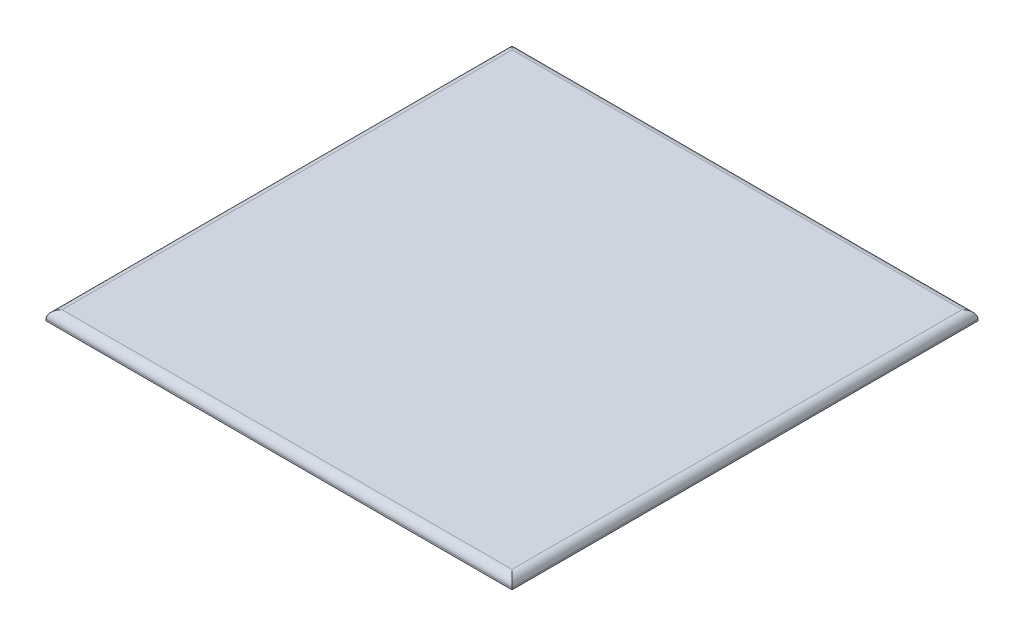
ISO-10303-21;
HEADER;
FILE_DESCRIPTION(('STEP AP214'),'2;1');
FILE_NAME('part.step','',(''),(''),'','','');
FILE_SCHEMA(('AUTOMOTIVE_DESIGN { 1 0 10303 214 1 1 1 1 }'));
ENDSEC;
DATA;
#1=APPLICATION_CONTEXT('core data for automotive mechanical design processes');
#2=APPLICATION_PROTOCOL_DEFINITION('international standard','automotive_design',2000,#1);
#3=PRODUCT_CONTEXT('',#1,'mechanical');
#4=PRODUCT('Part','Part','',(#3));
#5=PRODUCT_RELATED_PRODUCT_CATEGORY('part','',(#4));
#6=PRODUCT_DEFINITION_FORMATION('','',#4);
#7=PRODUCT_DEFINITION_CONTEXT('part definition',#1,'design');
#8=PRODUCT_DEFINITION('design','',#6,#7);
#9=PRODUCT_DEFINITION_SHAPE('','',#8);
#10=(LENGTH_UNIT() NAMED_UNIT(*) SI_UNIT(.MILLI.,.METRE.));
#11=(NAMED_UNIT(*) PLANE_ANGLE_UNIT() SI_UNIT($,.RADIAN.));
#12=(NAMED_UNIT(*) SI_UNIT($,.STERADIAN.) SOLID_ANGLE_UNIT());
#13=UNCERTAINTY_MEASURE_WITH_UNIT(LENGTH_MEASURE(1.E-05),#10,'distance_accuracy_value','');
#14=(GEOMETRIC_REPRESENTATION_CONTEXT(3) GLOBAL_UNCERTAINTY_ASSIGNED_CONTEXT((#13)) GLOBAL_UNIT_ASSIGNED_CONTEXT((#10,
#11,#12)) REPRESENTATION_CONTEXT('',''));
#15=CARTESIAN_POINT('',(0.,0.,0.));
#16=DIRECTION('',(0.,0.,1.));
#17=DIRECTION('',(1.,0.,0.));
#18=AXIS2_PLACEMENT_3D('',#15,#16,#17);
#19=CARTESIAN_POINT('',(0.,3.,0.));
#20=DIRECTION('',(1.,0.,0.));
#21=DIRECTION('',(0.,0.,-1.));
#22=AXIS2_PLACEMENT_3D('',#19,#20,#21);
#23=PLANE('',#22);
#24=DIRECTION('',(0.,-1.,0.));
#25=VECTOR('',#24,1.);
#26=CARTESIAN_POINT('',(0.,3.,0.));
#27=LINE('',#26,#25);
#28=CARTESIAN_POINT('',(0.,0.5,0.));
#29=VERTEX_POINT('',#28);
#30=CARTESIAN_POINT('',(0.,0.,0.));
#31=VERTEX_POINT('',#30);
#32=EDGE_CURVE('E168',#29,#31,#27,.T.);
#33=ORIENTED_EDGE('',*,*,#32,.F.);
#34=DIRECTION('',(0.,0.,1.));
#35=VECTOR('',#34,1.);
#36=CARTESIAN_POINT('',(0.,0.5,0.));
#37=LINE('',#36,#35);
#38=CARTESIAN_POINT('',(0.,0.5,-145.));
#39=VERTEX_POINT('',#38);
#40=EDGE_CURVE('E42',#29,#39,#37,.F.);
#41=ORIENTED_EDGE('',*,*,#40,.T.);
#42=DIRECTION('',(0.,-1.,0.));
#43=VECTOR('',#42,1.);
#44=CARTESIAN_POINT('',(0.,3.,-145.));
#45=LINE('',#44,#43);
#46=CARTESIAN_POINT('',(0.,0.,-145.));
#47=VERTEX_POINT('',#46);
#48=EDGE_CURVE('E162',#39,#47,#45,.T.);
#49=ORIENTED_EDGE('',*,*,#48,.T.);
#50=DIRECTION('',(0.,0.,1.));
#51=VECTOR('',#50,1.);
#52=CARTESIAN_POINT('',(0.,0.,0.));
#53=LINE('',#52,#51);
#54=EDGE_CURVE('E150',#47,#31,#53,.T.);
#55=ORIENTED_EDGE('',*,*,#54,.T.);
#56=EDGE_LOOP('',(#33,#41,#49,#55));
#57=FACE_BOUND('',#56,.T.);
#58=ADVANCED_FACE('F33',(#57),#23,.F.);
#59=CARTESIAN_POINT('',(0.,3.,0.));
#60=DIRECTION('',(0.,0.,-1.));
#61=DIRECTION('',(-1.,0.,0.));
#62=AXIS2_PLACEMENT_3D('',#59,#60,#61);
#63=PLANE('',#62);
#64=DIRECTION('',(0.,-1.,0.));
#65=VECTOR('',#64,1.);
#66=CARTESIAN_POINT('',(145.,3.,0.));
#67=LINE('',#66,#65);
#68=CARTESIAN_POINT('',(145.,0.5,0.));
#69=VERTEX_POINT('',#68);
#70=CARTESIAN_POINT('',(145.,0.,0.));
#71=VERTEX_POINT('',#70);
#72=EDGE_CURVE('E166',#69,#71,#67,.T.);
#73=ORIENTED_EDGE('',*,*,#72,.F.);
#74=DIRECTION('',(1.,0.,0.));
#75=VECTOR('',#74,1.);
#76=CARTESIAN_POINT('',(0.,0.5,0.));
#77=LINE('',#76,#75);
#78=EDGE_CURVE('E11',#69,#29,#77,.F.);
#79=ORIENTED_EDGE('',*,*,#78,.T.);
#80=ORIENTED_EDGE('',*,*,#32,.T.);
#81=DIRECTION('',(1.,0.,0.));
#82=VECTOR('',#81,1.);
#83=CARTESIAN_POINT('',(0.,0.,0.));
#84=LINE('',#83,#82);
#85=EDGE_CURVE('E153',#31,#71,#84,.T.);
#86=ORIENTED_EDGE('',*,*,#85,.T.);
#87=EDGE_LOOP('',(#73,#79,#80,#86));
#88=FACE_BOUND('',#87,.T.);
#89=ADVANCED_FACE('F213',(#88),#63,.F.);
#90=CARTESIAN_POINT('',(145.,3.,0.));
#91=DIRECTION('',(-1.,0.,0.));
#92=DIRECTION('',(0.,0.,1.));
#93=AXIS2_PLACEMENT_3D('',#90,#91,#92);
#94=PLANE('',#93);
#95=DIRECTION('',(0.,-1.,0.));
#96=VECTOR('',#95,1.);
#97=CARTESIAN_POINT('',(145.,3.,-145.));
#98=LINE('',#97,#96);
#99=CARTESIAN_POINT('',(145.,0.5,-145.));
#100=VERTEX_POINT('',#99);
#101=CARTESIAN_POINT('',(145.,0.,-145.));
#102=VERTEX_POINT('',#101);
#103=EDGE_CURVE('E164',#100,#102,#98,.T.);
#104=ORIENTED_EDGE('',*,*,#103,.F.);
#105=DIRECTION('',(0.,0.,-1.));
#106=VECTOR('',#105,1.);
#107=CARTESIAN_POINT('',(145.,0.5,0.));
#108=LINE('',#107,#106);
#109=EDGE_CURVE('E179',#100,#69,#108,.F.);
#110=ORIENTED_EDGE('',*,*,#109,.T.);
#111=ORIENTED_EDGE('',*,*,#72,.T.);
#112=DIRECTION('',(0.,0.,-1.));
#113=VECTOR('',#112,1.);
#114=CARTESIAN_POINT('',(145.,0.,0.));
#115=LINE('',#114,#113);
#116=EDGE_CURVE('E156',#71,#102,#115,.T.);
#117=ORIENTED_EDGE('',*,*,#116,.T.);
#118=EDGE_LOOP('',(#104,#110,#111,#117));
#119=FACE_BOUND('',#118,.T.);
#120=ADVANCED_FACE('F215',(#119),#94,.F.);
#121=CARTESIAN_POINT('',(0.,3.,-145.));
#122=DIRECTION('',(0.,0.,1.));
#123=DIRECTION('',(1.,0.,0.));
#124=AXIS2_PLACEMENT_3D('',#121,#122,#123);
#125=PLANE('',#124);
#126=ORIENTED_EDGE('',*,*,#48,.F.);
#127=DIRECTION('',(-1.,0.,0.));
#128=VECTOR('',#127,1.);
#129=CARTESIAN_POINT('',(0.,0.5,-145.));
#130=LINE('',#129,#128);
#131=EDGE_CURVE('E182',#39,#100,#130,.F.);
#132=ORIENTED_EDGE('',*,*,#131,.T.);
#133=ORIENTED_EDGE('',*,*,#103,.T.);
#134=DIRECTION('',(-1.,0.,0.));
#135=VECTOR('',#134,1.);
#136=CARTESIAN_POINT('',(0.,0.,-145.));
#137=LINE('',#136,#135);
#138=EDGE_CURVE('E159',#102,#47,#137,.T.);
#139=ORIENTED_EDGE('',*,*,#138,.T.);
#140=EDGE_LOOP('',(#126,#132,#133,#139));
#141=FACE_BOUND('',#140,.T.);
#142=ADVANCED_FACE('F205',(#141),#125,.F.);
#143=CARTESIAN_POINT('',(0.,3.,0.));
#144=DIRECTION('',(0.,-1.,0.));
#145=DIRECTION('',(0.,0.,-1.));
#146=AXIS2_PLACEMENT_3D('',#143,#144,#145);
#147=PLANE('',#146);
#148=DIRECTION('',(1.,0.,0.));
#149=VECTOR('',#148,1.);
#150=CARTESIAN_POINT('',(0.,3.,-2.5));
#151=LINE('',#150,#149);
#152=CARTESIAN_POINT('',(2.5,3.,-2.5));
#153=VERTEX_POINT('',#152);
#154=CARTESIAN_POINT('',(142.5,3.,-2.5));
#155=VERTEX_POINT('',#154);
#156=EDGE_CURVE('E170',#153,#155,#151,.T.);
#157=ORIENTED_EDGE('',*,*,#156,.T.);
#158=DIRECTION('',(0.,0.,-1.));
#159=VECTOR('',#158,1.);
#160=CARTESIAN_POINT('',(142.5,3.,0.));
#161=LINE('',#160,#159);
#162=CARTESIAN_POINT('',(142.5,3.,-142.5));
#163=VERTEX_POINT('',#162);
#164=EDGE_CURVE('E176',#155,#163,#161,.T.);
#165=ORIENTED_EDGE('',*,*,#164,.T.);
#166=DIRECTION('',(-1.,0.,0.));
#167=VECTOR('',#166,1.);
#168=CARTESIAN_POINT('',(0.,3.,-142.5));
#169=LINE('',#168,#167);
#170=CARTESIAN_POINT('',(2.5,3.,-142.5));
#171=VERTEX_POINT('',#170);
#172=EDGE_CURVE('E174',#163,#171,#169,.T.);
#173=ORIENTED_EDGE('',*,*,#172,.T.);
#174=DIRECTION('',(0.,0.,1.));
#175=VECTOR('',#174,1.);
#176=CARTESIAN_POINT('',(2.5,3.,0.));
#177=LINE('',#176,#175);
#178=EDGE_CURVE('E172',#171,#153,#177,.T.);
#179=ORIENTED_EDGE('',*,*,#178,.T.);
#180=EDGE_LOOP('',(#157,#165,#173,#179));
#181=FACE_BOUND('',#180,.T.);
#182=ADVANCED_FACE('F223',(#181),#147,.F.);
#183=CARTESIAN_POINT('',(0.,0.,0.));
#184=DIRECTION('',(0.,-1.,0.));
#185=DIRECTION('',(0.,0.,-1.));
#186=AXIS2_PLACEMENT_3D('',#183,#184,#185);
#187=PLANE('',#186);
#188=DIRECTION('',(0.,0.,-1.));
#189=VECTOR('',#188,1.);
#190=CARTESIAN_POINT('',(60.,0.,-30.));
#191=LINE('',#190,#189);
#192=CARTESIAN_POINT('',(60.,0.,-30.));
#193=VERTEX_POINT('',#192);
#194=CARTESIAN_POINT('',(60.,0.,-45.));
#195=VERTEX_POINT('',#194);
#196=EDGE_CURVE('E50',#193,#195,#191,.T.);
#197=ORIENTED_EDGE('',*,*,#196,.F.);
#198=DIRECTION('',(-1.,0.,0.));
#199=VECTOR('',#198,1.);
#200=CARTESIAN_POINT('',(60.,0.,-30.));
#201=LINE('',#200,#199);
#202=CARTESIAN_POINT('',(85.,0.,-30.));
#203=VERTEX_POINT('',#202);
#204=EDGE_CURVE('E131',#203,#193,#201,.T.);
#205=ORIENTED_EDGE('',*,*,#204,.F.);
#206=DIRECTION('',(0.,0.,1.));
#207=VECTOR('',#206,1.);
#208=CARTESIAN_POINT('',(85.,0.,-30.));
#209=LINE('',#208,#207);
#210=CARTESIAN_POINT('',(85.,0.,-45.));
#211=VERTEX_POINT('',#210);
#212=EDGE_CURVE('E134',#211,#203,#209,.T.);
#213=ORIENTED_EDGE('',*,*,#212,.F.);
#214=DIRECTION('',(1.,0.,0.));
#215=VECTOR('',#214,1.);
#216=CARTESIAN_POINT('',(60.,0.,-45.));
#217=LINE('',#216,#215);
#218=EDGE_CURVE('E140',#195,#211,#217,.T.);
#219=ORIENTED_EDGE('',*,*,#218,.F.);
#220=EDGE_LOOP('',(#197,#205,#213,#219));
#221=FACE_BOUND('',#220,.T.);
#222=ORIENTED_EDGE('',*,*,#54,.F.);
#223=ORIENTED_EDGE('',*,*,#138,.F.);
#224=ORIENTED_EDGE('',*,*,#116,.F.);
#225=ORIENTED_EDGE('',*,*,#85,.F.);
#226=EDGE_LOOP('',(#222,#223,#224,#225));
#227=FACE_BOUND('',#226,.T.);
#228=ADVANCED_FACE('F212',(#221,#227),#187,.T.);
#229=CARTESIAN_POINT('',(2.5,0.5,0.));
#230=DIRECTION('',(0.,0.,1.));
#231=DIRECTION('',(1.,0.,0.));
#232=AXIS2_PLACEMENT_3D('',#229,#230,#231);
#233=CYLINDRICAL_SURFACE('',#232,2.5);
#234=CARTESIAN_POINT('',(2.5,0.5,-142.5));
#235=DIRECTION('',(-0.707106781186547,0.,0.707106781186547));
#236=DIRECTION('',(0.707106781186547,0.,0.707106781186547));
#237=AXIS2_PLACEMENT_3D('',#234,#235,#236);
#238=ELLIPSE('',#237,3.53553390593274,2.5);
#239=EDGE_CURVE('E187',#39,#171,#238,.F.);
#240=ORIENTED_EDGE('',*,*,#239,.F.);
#241=ORIENTED_EDGE('',*,*,#40,.F.);
#242=CARTESIAN_POINT('',(2.5,0.5,-2.5));
#243=DIRECTION('',(0.707106781186547,0.,0.707106781186547));
#244=DIRECTION('',(0.707106781186547,0.,-0.707106781186547));
#245=AXIS2_PLACEMENT_3D('',#242,#243,#244);
#246=ELLIPSE('',#245,3.53553390593274,2.5);
#247=EDGE_CURVE('E37',#153,#29,#246,.T.);
#248=ORIENTED_EDGE('',*,*,#247,.F.);
#249=ORIENTED_EDGE('',*,*,#178,.F.);
#250=EDGE_LOOP('',(#240,#241,#248,#249));
#251=FACE_BOUND('',#250,.T.);
#252=ADVANCED_FACE('F35',(#251),#233,.T.);
#253=CARTESIAN_POINT('',(0.,0.5,-2.5));
#254=DIRECTION('',(1.,0.,0.));
#255=DIRECTION('',(0.,0.,-1.));
#256=AXIS2_PLACEMENT_3D('',#253,#254,#255);
#257=CYLINDRICAL_SURFACE('',#256,2.5);
#258=ORIENTED_EDGE('',*,*,#247,.T.);
#259=ORIENTED_EDGE('',*,*,#78,.F.);
#260=CARTESIAN_POINT('',(142.5,0.5,-2.5));
#261=DIRECTION('',(0.707106781186547,0.,-0.707106781186547));
#262=DIRECTION('',(0.707106781186547,0.,0.707106781186547));
#263=AXIS2_PLACEMENT_3D('',#260,#261,#262);
#264=ELLIPSE('',#263,3.53553390593274,2.5);
#265=EDGE_CURVE('E186',#155,#69,#264,.T.);
#266=ORIENTED_EDGE('',*,*,#265,.F.);
#267=ORIENTED_EDGE('',*,*,#156,.F.);
#268=EDGE_LOOP('',(#258,#259,#266,#267));
#269=FACE_BOUND('',#268,.T.);
#270=ADVANCED_FACE('F197',(#269),#257,.T.);
#271=CARTESIAN_POINT('',(0.,0.5,-142.5));
#272=DIRECTION('',(-1.,0.,0.));
#273=DIRECTION('',(0.,0.,1.));
#274=AXIS2_PLACEMENT_3D('',#271,#272,#273);
#275=CYLINDRICAL_SURFACE('',#274,2.5);
#276=ORIENTED_EDGE('',*,*,#239,.T.);
#277=ORIENTED_EDGE('',*,*,#172,.F.);
#278=CARTESIAN_POINT('',(142.5,0.5,-142.5));
#279=DIRECTION('',(-0.707106781186547,0.,-0.707106781186547));
#280=DIRECTION('',(-0.707106781186547,0.,0.707106781186547));
#281=AXIS2_PLACEMENT_3D('',#278,#279,#280);
#282=ELLIPSE('',#281,3.53553390593274,2.5);
#283=EDGE_CURVE('E146',#100,#163,#282,.F.);
#284=ORIENTED_EDGE('',*,*,#283,.F.);
#285=ORIENTED_EDGE('',*,*,#131,.F.);
#286=EDGE_LOOP('',(#276,#277,#284,#285));
#287=FACE_BOUND('',#286,.T.);
#288=ADVANCED_FACE('F221',(#287),#275,.T.);
#289=CARTESIAN_POINT('',(142.5,0.5,0.));
#290=DIRECTION('',(0.,0.,-1.));
#291=DIRECTION('',(-1.,0.,0.));
#292=AXIS2_PLACEMENT_3D('',#289,#290,#291);
#293=CYLINDRICAL_SURFACE('',#292,2.5);
#294=ORIENTED_EDGE('',*,*,#265,.T.);
#295=ORIENTED_EDGE('',*,*,#109,.F.);
#296=ORIENTED_EDGE('',*,*,#283,.T.);
#297=ORIENTED_EDGE('',*,*,#164,.F.);
#298=EDGE_LOOP('',(#294,#295,#296,#297));
#299=FACE_BOUND('',#298,.T.);
#300=ADVANCED_FACE('F219',(#299),#293,.T.);
#301=CARTESIAN_POINT('',(60.,1.,-30.));
#302=DIRECTION('',(-1.,0.,0.));
#303=DIRECTION('',(0.,0.,1.));
#304=AXIS2_PLACEMENT_3D('',#301,#302,#303);
#305=PLANE('',#304);
#306=ORIENTED_EDGE('',*,*,#196,.T.);
#307=DIRECTION('',(0.,-1.,0.));
#308=VECTOR('',#307,1.);
#309=CARTESIAN_POINT('',(60.,1.,-45.));
#310=LINE('',#309,#308);
#311=CARTESIAN_POINT('',(60.,1.,-45.));
#312=VERTEX_POINT('',#311);
#313=EDGE_CURVE('E109',#312,#195,#310,.T.);
#314=ORIENTED_EDGE('',*,*,#313,.F.);
#315=DIRECTION('',(0.,0.,-1.));
#316=VECTOR('',#315,1.);
#317=CARTESIAN_POINT('',(60.,1.,-30.));
#318=LINE('',#317,#316);
#319=CARTESIAN_POINT('',(60.,1.,-30.));
#320=VERTEX_POINT('',#319);
#321=EDGE_CURVE('E113',#320,#312,#318,.T.);
#322=ORIENTED_EDGE('',*,*,#321,.F.);
#323=DIRECTION('',(0.,-1.,0.));
#324=VECTOR('',#323,1.);
#325=CARTESIAN_POINT('',(60.,1.,-30.));
#326=LINE('',#325,#324);
#327=EDGE_CURVE('E144',#320,#193,#326,.T.);
#328=ORIENTED_EDGE('',*,*,#327,.T.);
#329=EDGE_LOOP('',(#306,#314,#322,#328));
#330=FACE_BOUND('',#329,.T.);
#331=ADVANCED_FACE('F111',(#330),#305,.F.);
#332=CARTESIAN_POINT('',(60.,1.,-30.));
#333=DIRECTION('',(0.,0.,1.));
#334=DIRECTION('',(1.,0.,0.));
#335=AXIS2_PLACEMENT_3D('',#332,#333,#334);
#336=PLANE('',#335);
#337=ORIENTED_EDGE('',*,*,#204,.T.);
#338=ORIENTED_EDGE('',*,*,#327,.F.);
#339=DIRECTION('',(-1.,0.,0.));
#340=VECTOR('',#339,1.);
#341=CARTESIAN_POINT('',(60.,1.,-30.));
#342=LINE('',#341,#340);
#343=CARTESIAN_POINT('',(85.,1.,-30.));
#344=VERTEX_POINT('',#343);
#345=EDGE_CURVE('E119',#344,#320,#342,.T.);
#346=ORIENTED_EDGE('',*,*,#345,.F.);
#347=DIRECTION('',(0.,-1.,0.));
#348=VECTOR('',#347,1.);
#349=CARTESIAN_POINT('',(85.,1.,-30.));
#350=LINE('',#349,#348);
#351=EDGE_CURVE('E147',#344,#203,#350,.T.);
#352=ORIENTED_EDGE('',*,*,#351,.T.);
#353=EDGE_LOOP('',(#337,#338,#346,#352));
#354=FACE_BOUND('',#353,.T.);
#355=ADVANCED_FACE('F269',(#354),#336,.F.);
#356=CARTESIAN_POINT('',(85.,1.,-30.));
#357=DIRECTION('',(1.,0.,0.));
#358=DIRECTION('',(0.,0.,-1.));
#359=AXIS2_PLACEMENT_3D('',#356,#357,#358);
#360=PLANE('',#359);
#361=ORIENTED_EDGE('',*,*,#212,.T.);
#362=ORIENTED_EDGE('',*,*,#351,.F.);
#363=DIRECTION('',(0.,0.,1.));
#364=VECTOR('',#363,1.);
#365=CARTESIAN_POINT('',(85.,1.,-30.));
#366=LINE('',#365,#364);
#367=CARTESIAN_POINT('',(85.,1.,-45.));
#368=VERTEX_POINT('',#367);
#369=EDGE_CURVE('E127',#368,#344,#366,.T.);
#370=ORIENTED_EDGE('',*,*,#369,.F.);
#371=DIRECTION('',(0.,-1.,0.));
#372=VECTOR('',#371,1.);
#373=CARTESIAN_POINT('',(85.,1.,-45.));
#374=LINE('',#373,#372);
#375=EDGE_CURVE('E118',#368,#211,#374,.T.);
#376=ORIENTED_EDGE('',*,*,#375,.T.);
#377=EDGE_LOOP('',(#361,#362,#370,#376));
#378=FACE_BOUND('',#377,.T.);
#379=ADVANCED_FACE('F277',(#378),#360,.F.);
#380=CARTESIAN_POINT('',(60.,1.,-45.));
#381=DIRECTION('',(0.,0.,-1.));
#382=DIRECTION('',(-1.,0.,0.));
#383=AXIS2_PLACEMENT_3D('',#380,#381,#382);
#384=PLANE('',#383);
#385=ORIENTED_EDGE('',*,*,#218,.T.);
#386=ORIENTED_EDGE('',*,*,#375,.F.);
#387=DIRECTION('',(1.,0.,0.));
#388=VECTOR('',#387,1.);
#389=CARTESIAN_POINT('',(60.,1.,-45.));
#390=LINE('',#389,#388);
#391=EDGE_CURVE('E122',#312,#368,#390,.T.);
#392=ORIENTED_EDGE('',*,*,#391,.F.);
#393=ORIENTED_EDGE('',*,*,#313,.T.);
#394=EDGE_LOOP('',(#385,#386,#392,#393));
#395=FACE_BOUND('',#394,.T.);
#396=ADVANCED_FACE('F123',(#395),#384,.F.);
#397=CARTESIAN_POINT('',(0.,1.,0.));
#398=DIRECTION('',(0.,-1.,0.));
#399=DIRECTION('',(0.,0.,-1.));
#400=AXIS2_PLACEMENT_3D('',#397,#398,#399);
#401=PLANE('',#400);
#402=ORIENTED_EDGE('',*,*,#321,.T.);
#403=ORIENTED_EDGE('',*,*,#391,.T.);
#404=ORIENTED_EDGE('',*,*,#369,.T.);
#405=ORIENTED_EDGE('',*,*,#345,.T.);
#406=EDGE_LOOP('',(#402,#403,#404,#405));
#407=FACE_BOUND('',#406,.T.);
#408=ADVANCED_FACE('F129',(#407),#401,.T.);
#409=CLOSED_SHELL('',(#58,#89,#120,#142,#182,#228,#252,#270,#288,#300,#331,#355,#379,#396,#408));
#410=MANIFOLD_SOLID_BREP('B2',#409);
#411=ADVANCED_BREP_SHAPE_REPRESENTATION('',(#18,#410),#14);
#412=SHAPE_DEFINITION_REPRESENTATION(#9,#411);
ENDSEC;
END-ISO-10303-21;
